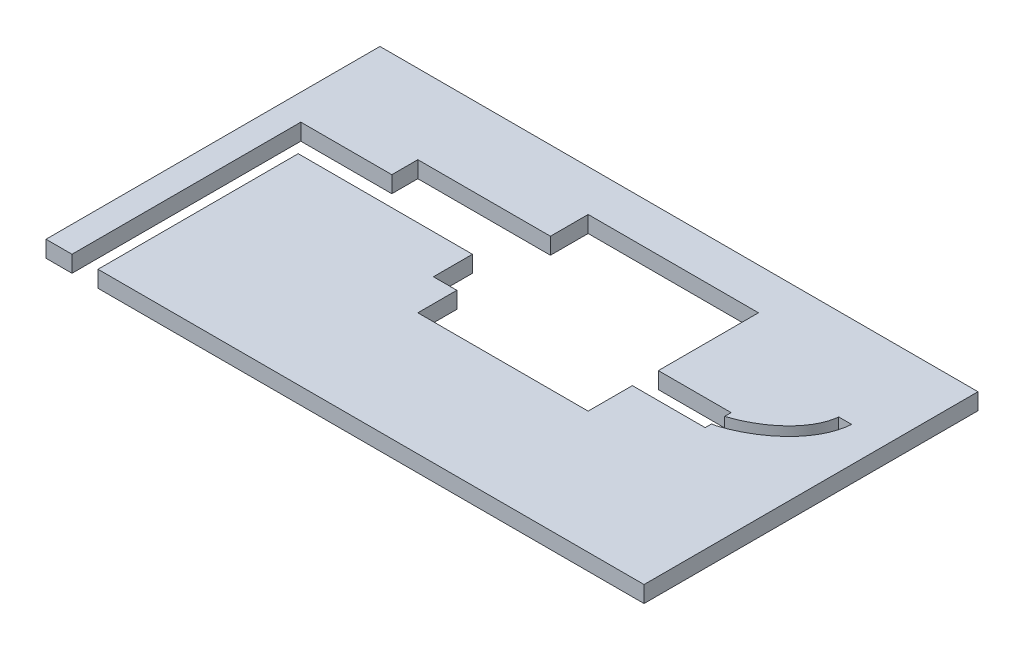
ISO-10303-21;
HEADER;
FILE_DESCRIPTION(('STEP AP214'),'2;1');
FILE_NAME('part.step','',(''),(''),'','','');
FILE_SCHEMA(('AUTOMOTIVE_DESIGN { 1 0 10303 214 1 1 1 1 }'));
ENDSEC;
DATA;
#1=APPLICATION_CONTEXT('core data for automotive mechanical design processes');
#2=APPLICATION_PROTOCOL_DEFINITION('international standard','automotive_design',2000,#1);
#3=PRODUCT_CONTEXT('',#1,'mechanical');
#4=PRODUCT('Part','Part','',(#3));
#5=PRODUCT_RELATED_PRODUCT_CATEGORY('part','',(#4));
#6=PRODUCT_DEFINITION_FORMATION('','',#4);
#7=PRODUCT_DEFINITION_CONTEXT('part definition',#1,'design');
#8=PRODUCT_DEFINITION('design','',#6,#7);
#9=PRODUCT_DEFINITION_SHAPE('','',#8);
#10=(LENGTH_UNIT() NAMED_UNIT(*) SI_UNIT(.MILLI.,.METRE.));
#11=(NAMED_UNIT(*) PLANE_ANGLE_UNIT() SI_UNIT($,.RADIAN.));
#12=(NAMED_UNIT(*) SI_UNIT($,.STERADIAN.) SOLID_ANGLE_UNIT());
#13=UNCERTAINTY_MEASURE_WITH_UNIT(LENGTH_MEASURE(1.E-05),#10,'distance_accuracy_value','');
#14=(GEOMETRIC_REPRESENTATION_CONTEXT(3) GLOBAL_UNCERTAINTY_ASSIGNED_CONTEXT((#13)) GLOBAL_UNIT_ASSIGNED_CONTEXT((#10,
#11,#12)) REPRESENTATION_CONTEXT('',''));
#15=CARTESIAN_POINT('',(0.,0.,0.));
#16=DIRECTION('',(0.,0.,1.));
#17=DIRECTION('',(1.,0.,0.));
#18=AXIS2_PLACEMENT_3D('',#15,#16,#17);
#19=CARTESIAN_POINT('',(115.,6.35,64.2155178586557));
#20=DIRECTION('',(-1.,0.,0.));
#21=DIRECTION('',(0.,0.,1.));
#22=AXIS2_PLACEMENT_3D('',#19,#20,#21);
#23=PLANE('',#22);
#24=DIRECTION('',(0.,0.,-1.));
#25=VECTOR('',#24,1.);
#26=CARTESIAN_POINT('',(115.,0.,64.2155178586557));
#27=LINE('',#26,#25);
#28=CARTESIAN_POINT('',(115.,0.,64.2155178586557));
#29=VERTEX_POINT('',#28);
#30=CARTESIAN_POINT('',(115.,0.,-64.2155178586557));
#31=VERTEX_POINT('',#30);
#32=EDGE_CURVE('E243',#29,#31,#27,.T.);
#33=ORIENTED_EDGE('',*,*,#32,.T.);
#34=DIRECTION('',(0.,-1.,0.));
#35=VECTOR('',#34,1.);
#36=CARTESIAN_POINT('',(115.,6.35,-64.2155178586557));
#37=LINE('',#36,#35);
#38=CARTESIAN_POINT('',(115.,6.35,-64.2155178586557));
#39=VERTEX_POINT('',#38);
#40=EDGE_CURVE('E11',#39,#31,#37,.T.);
#41=ORIENTED_EDGE('',*,*,#40,.F.);
#42=DIRECTION('',(0.,0.,-1.));
#43=VECTOR('',#42,1.);
#44=CARTESIAN_POINT('',(115.,6.35,64.2155178586557));
#45=LINE('',#44,#43);
#46=CARTESIAN_POINT('',(115.,6.35,64.2155178586557));
#47=VERTEX_POINT('',#46);
#48=EDGE_CURVE('E305',#47,#39,#45,.T.);
#49=ORIENTED_EDGE('',*,*,#48,.F.);
#50=DIRECTION('',(0.,-1.,0.));
#51=VECTOR('',#50,1.);
#52=CARTESIAN_POINT('',(115.,6.35,64.2155178586557));
#53=LINE('',#52,#51);
#54=EDGE_CURVE('E239',#47,#29,#53,.T.);
#55=ORIENTED_EDGE('',*,*,#54,.T.);
#56=EDGE_LOOP('',(#33,#41,#49,#55));
#57=FACE_BOUND('',#56,.T.);
#58=ADVANCED_FACE('F33',(#57),#23,.F.);
#59=CARTESIAN_POINT('',(-115.,6.35,-64.2155178586557));
#60=DIRECTION('',(0.,0.,1.));
#61=DIRECTION('',(1.,0.,0.));
#62=AXIS2_PLACEMENT_3D('',#59,#60,#61);
#63=PLANE('',#62);
#64=DIRECTION('',(-1.,0.,0.));
#65=VECTOR('',#64,1.);
#66=CARTESIAN_POINT('',(-115.,0.,-64.2155178586557));
#67=LINE('',#66,#65);
#68=CARTESIAN_POINT('',(-115.,0.,-64.2155178586557));
#69=VERTEX_POINT('',#68);
#70=EDGE_CURVE('E246',#31,#69,#67,.T.);
#71=ORIENTED_EDGE('',*,*,#70,.T.);
#72=DIRECTION('',(0.,-1.,0.));
#73=VECTOR('',#72,1.);
#74=CARTESIAN_POINT('',(-115.,6.35,-64.2155178586557));
#75=LINE('',#74,#73);
#76=CARTESIAN_POINT('',(-115.,6.35,-64.2155178586557));
#77=VERTEX_POINT('',#76);
#78=EDGE_CURVE('E41',#77,#69,#75,.T.);
#79=ORIENTED_EDGE('',*,*,#78,.F.);
#80=DIRECTION('',(-1.,0.,0.));
#81=VECTOR('',#80,1.);
#82=CARTESIAN_POINT('',(-115.,6.35,-64.2155178586557));
#83=LINE('',#82,#81);
#84=EDGE_CURVE('E149',#39,#77,#83,.T.);
#85=ORIENTED_EDGE('',*,*,#84,.F.);
#86=ORIENTED_EDGE('',*,*,#40,.T.);
#87=EDGE_LOOP('',(#71,#79,#85,#86));
#88=FACE_BOUND('',#87,.T.);
#89=ADVANCED_FACE('F470',(#88),#63,.F.);
#90=CARTESIAN_POINT('',(-115.,6.35,64.2155178586557));
#91=DIRECTION('',(1.,0.,0.));
#92=DIRECTION('',(0.,0.,-1.));
#93=AXIS2_PLACEMENT_3D('',#90,#91,#92);
#94=PLANE('',#93);
#95=DIRECTION('',(0.,0.,1.));
#96=VECTOR('',#95,1.);
#97=CARTESIAN_POINT('',(-115.,0.,64.2155178586557));
#98=LINE('',#97,#96);
#99=CARTESIAN_POINT('',(-115.,0.,64.2155178586557));
#100=VERTEX_POINT('',#99);
#101=EDGE_CURVE('E248',#69,#100,#98,.T.);
#102=ORIENTED_EDGE('',*,*,#101,.T.);
#103=DIRECTION('',(0.,-1.,0.));
#104=VECTOR('',#103,1.);
#105=CARTESIAN_POINT('',(-115.,6.35,64.2155178586557));
#106=LINE('',#105,#104);
#107=CARTESIAN_POINT('',(-115.,6.35,64.2155178586557));
#108=VERTEX_POINT('',#107);
#109=EDGE_CURVE('E369',#108,#100,#106,.T.);
#110=ORIENTED_EDGE('',*,*,#109,.F.);
#111=DIRECTION('',(0.,0.,1.));
#112=VECTOR('',#111,1.);
#113=CARTESIAN_POINT('',(-115.,6.35,64.2155178586557));
#114=LINE('',#113,#112);
#115=EDGE_CURVE('E377',#77,#108,#114,.T.);
#116=ORIENTED_EDGE('',*,*,#115,.F.);
#117=ORIENTED_EDGE('',*,*,#78,.T.);
#118=EDGE_LOOP('',(#102,#110,#116,#117));
#119=FACE_BOUND('',#118,.T.);
#120=ADVANCED_FACE('F375',(#119),#94,.F.);
#121=CARTESIAN_POINT('',(-115.,6.35,64.2155178586557));
#122=DIRECTION('',(0.,0.,-1.));
#123=DIRECTION('',(-1.,0.,0.));
#124=AXIS2_PLACEMENT_3D('',#121,#122,#123);
#125=PLANE('',#124);
#126=DIRECTION('',(1.,0.,0.));
#127=VECTOR('',#126,1.);
#128=CARTESIAN_POINT('',(-115.,0.,64.2155178586557));
#129=LINE('',#128,#127);
#130=CARTESIAN_POINT('',(-105.,0.,64.2155178586557));
#131=VERTEX_POINT('',#130);
#132=EDGE_CURVE('E250',#100,#131,#129,.T.);
#133=ORIENTED_EDGE('',*,*,#132,.T.);
#134=DIRECTION('',(0.,-1.,0.));
#135=VECTOR('',#134,1.);
#136=CARTESIAN_POINT('',(-105.,6.35,64.2155178586557));
#137=LINE('',#136,#135);
#138=CARTESIAN_POINT('',(-105.,6.35,64.2155178586557));
#139=VERTEX_POINT('',#138);
#140=EDGE_CURVE('E366',#139,#131,#137,.T.);
#141=ORIENTED_EDGE('',*,*,#140,.F.);
#142=DIRECTION('',(1.,0.,0.));
#143=VECTOR('',#142,1.);
#144=CARTESIAN_POINT('',(-115.,6.35,64.2155178586557));
#145=LINE('',#144,#143);
#146=EDGE_CURVE('E395',#108,#139,#145,.T.);
#147=ORIENTED_EDGE('',*,*,#146,.F.);
#148=ORIENTED_EDGE('',*,*,#109,.T.);
#149=EDGE_LOOP('',(#133,#141,#147,#148));
#150=FACE_BOUND('',#149,.T.);
#151=ADVANCED_FACE('F386',(#150),#125,.F.);
#152=CARTESIAN_POINT('',(-105.,6.35,-23.7844821413443));
#153=DIRECTION('',(-1.,0.,0.));
#154=DIRECTION('',(0.,0.,1.));
#155=AXIS2_PLACEMENT_3D('',#152,#153,#154);
#156=PLANE('',#155);
#157=DIRECTION('',(0.,0.,-1.));
#158=VECTOR('',#157,1.);
#159=CARTESIAN_POINT('',(-105.,0.,-23.7844821413443));
#160=LINE('',#159,#158);
#161=CARTESIAN_POINT('',(-105.,0.,-23.7844821413443));
#162=VERTEX_POINT('',#161);
#163=EDGE_CURVE('E252',#131,#162,#160,.T.);
#164=ORIENTED_EDGE('',*,*,#163,.T.);
#165=DIRECTION('',(0.,-1.,0.));
#166=VECTOR('',#165,1.);
#167=CARTESIAN_POINT('',(-105.,6.35,-23.7844821413443));
#168=LINE('',#167,#166);
#169=CARTESIAN_POINT('',(-105.,6.35,-23.7844821413443));
#170=VERTEX_POINT('',#169);
#171=EDGE_CURVE('E363',#170,#162,#168,.T.);
#172=ORIENTED_EDGE('',*,*,#171,.F.);
#173=DIRECTION('',(0.,0.,-1.));
#174=VECTOR('',#173,1.);
#175=CARTESIAN_POINT('',(-105.,6.35,-23.7844821413443));
#176=LINE('',#175,#174);
#177=EDGE_CURVE('E392',#139,#170,#176,.T.);
#178=ORIENTED_EDGE('',*,*,#177,.F.);
#179=ORIENTED_EDGE('',*,*,#140,.T.);
#180=EDGE_LOOP('',(#164,#172,#178,#179));
#181=FACE_BOUND('',#180,.T.);
#182=ADVANCED_FACE('F390',(#181),#156,.F.);
#183=CARTESIAN_POINT('',(-70.,6.35,-23.7844821413443));
#184=DIRECTION('',(0.,0.,-1.));
#185=DIRECTION('',(-1.,0.,0.));
#186=AXIS2_PLACEMENT_3D('',#183,#184,#185);
#187=PLANE('',#186);
#188=DIRECTION('',(1.,0.,0.));
#189=VECTOR('',#188,1.);
#190=CARTESIAN_POINT('',(-70.,0.,-23.7844821413443));
#191=LINE('',#190,#189);
#192=CARTESIAN_POINT('',(-70.,0.,-23.7844821413443));
#193=VERTEX_POINT('',#192);
#194=EDGE_CURVE('E254',#162,#193,#191,.T.);
#195=ORIENTED_EDGE('',*,*,#194,.T.);
#196=DIRECTION('',(0.,-1.,0.));
#197=VECTOR('',#196,1.);
#198=CARTESIAN_POINT('',(-70.,6.35,-23.7844821413443));
#199=LINE('',#198,#197);
#200=CARTESIAN_POINT('',(-70.,6.35,-23.7844821413443));
#201=VERTEX_POINT('',#200);
#202=EDGE_CURVE('E360',#201,#193,#199,.T.);
#203=ORIENTED_EDGE('',*,*,#202,.F.);
#204=DIRECTION('',(1.,0.,0.));
#205=VECTOR('',#204,1.);
#206=CARTESIAN_POINT('',(-70.,6.35,-23.7844821413443));
#207=LINE('',#206,#205);
#208=EDGE_CURVE('E394',#170,#201,#207,.T.);
#209=ORIENTED_EDGE('',*,*,#208,.F.);
#210=ORIENTED_EDGE('',*,*,#171,.T.);
#211=EDGE_LOOP('',(#195,#203,#209,#210));
#212=FACE_BOUND('',#211,.T.);
#213=ADVANCED_FACE('F460',(#212),#187,.F.);
#214=CARTESIAN_POINT('',(-70.,6.35,-33.7844821413443));
#215=DIRECTION('',(-1.,0.,0.));
#216=DIRECTION('',(0.,0.,1.));
#217=AXIS2_PLACEMENT_3D('',#214,#215,#216);
#218=PLANE('',#217);
#219=DIRECTION('',(0.,0.,-1.));
#220=VECTOR('',#219,1.);
#221=CARTESIAN_POINT('',(-70.,0.,-33.7844821413443));
#222=LINE('',#221,#220);
#223=CARTESIAN_POINT('',(-70.,0.,-33.7844821413443));
#224=VERTEX_POINT('',#223);
#225=EDGE_CURVE('E256',#193,#224,#222,.T.);
#226=ORIENTED_EDGE('',*,*,#225,.T.);
#227=DIRECTION('',(0.,-1.,0.));
#228=VECTOR('',#227,1.);
#229=CARTESIAN_POINT('',(-70.,6.35,-33.7844821413443));
#230=LINE('',#229,#228);
#231=CARTESIAN_POINT('',(-70.,6.35,-33.7844821413443));
#232=VERTEX_POINT('',#231);
#233=EDGE_CURVE('E357',#232,#224,#230,.T.);
#234=ORIENTED_EDGE('',*,*,#233,.F.);
#235=DIRECTION('',(0.,0.,-1.));
#236=VECTOR('',#235,1.);
#237=CARTESIAN_POINT('',(-70.,6.35,-33.7844821413443));
#238=LINE('',#237,#236);
#239=EDGE_CURVE('E397',#201,#232,#238,.T.);
#240=ORIENTED_EDGE('',*,*,#239,.F.);
#241=ORIENTED_EDGE('',*,*,#202,.T.);
#242=EDGE_LOOP('',(#226,#234,#240,#241));
#243=FACE_BOUND('',#242,.T.);
#244=ADVANCED_FACE('F456',(#243),#218,.F.);
#245=CARTESIAN_POINT('',(-19.,6.35,-33.7844821413443));
#246=DIRECTION('',(0.,0.,-1.));
#247=DIRECTION('',(-1.,0.,0.));
#248=AXIS2_PLACEMENT_3D('',#245,#246,#247);
#249=PLANE('',#248);
#250=DIRECTION('',(1.,0.,0.));
#251=VECTOR('',#250,1.);
#252=CARTESIAN_POINT('',(-19.,0.,-33.7844821413443));
#253=LINE('',#252,#251);
#254=CARTESIAN_POINT('',(-19.,0.,-33.7844821413443));
#255=VERTEX_POINT('',#254);
#256=EDGE_CURVE('E258',#224,#255,#253,.T.);
#257=ORIENTED_EDGE('',*,*,#256,.T.);
#258=DIRECTION('',(0.,-1.,0.));
#259=VECTOR('',#258,1.);
#260=CARTESIAN_POINT('',(-19.,6.35,-33.7844821413443));
#261=LINE('',#260,#259);
#262=CARTESIAN_POINT('',(-19.,6.35,-33.7844821413443));
#263=VERTEX_POINT('',#262);
#264=EDGE_CURVE('E354',#263,#255,#261,.T.);
#265=ORIENTED_EDGE('',*,*,#264,.F.);
#266=DIRECTION('',(1.,0.,0.));
#267=VECTOR('',#266,1.);
#268=CARTESIAN_POINT('',(-19.,6.35,-33.7844821413443));
#269=LINE('',#268,#267);
#270=EDGE_CURVE('E403',#232,#263,#269,.T.);
#271=ORIENTED_EDGE('',*,*,#270,.F.);
#272=ORIENTED_EDGE('',*,*,#233,.T.);
#273=EDGE_LOOP('',(#257,#265,#271,#272));
#274=FACE_BOUND('',#273,.T.);
#275=ADVANCED_FACE('F452',(#274),#249,.F.);
#276=CARTESIAN_POINT('',(-19.,6.35,-48.2844821413443));
#277=DIRECTION('',(-1.,0.,0.));
#278=DIRECTION('',(0.,0.,1.));
#279=AXIS2_PLACEMENT_3D('',#276,#277,#278);
#280=PLANE('',#279);
#281=DIRECTION('',(0.,0.,-1.));
#282=VECTOR('',#281,1.);
#283=CARTESIAN_POINT('',(-19.,0.,-48.2844821413443));
#284=LINE('',#283,#282);
#285=CARTESIAN_POINT('',(-19.,0.,-48.2844821413443));
#286=VERTEX_POINT('',#285);
#287=EDGE_CURVE('E260',#255,#286,#284,.T.);
#288=ORIENTED_EDGE('',*,*,#287,.T.);
#289=DIRECTION('',(0.,-1.,0.));
#290=VECTOR('',#289,1.);
#291=CARTESIAN_POINT('',(-19.,6.35,-48.2844821413443));
#292=LINE('',#291,#290);
#293=CARTESIAN_POINT('',(-19.,6.35,-48.2844821413443));
#294=VERTEX_POINT('',#293);
#295=EDGE_CURVE('E351',#294,#286,#292,.T.);
#296=ORIENTED_EDGE('',*,*,#295,.F.);
#297=DIRECTION('',(0.,0.,-1.));
#298=VECTOR('',#297,1.);
#299=CARTESIAN_POINT('',(-19.,6.35,-48.2844821413443));
#300=LINE('',#299,#298);
#301=EDGE_CURVE('E405',#263,#294,#300,.T.);
#302=ORIENTED_EDGE('',*,*,#301,.F.);
#303=ORIENTED_EDGE('',*,*,#264,.T.);
#304=EDGE_LOOP('',(#288,#296,#302,#303));
#305=FACE_BOUND('',#304,.T.);
#306=ADVANCED_FACE('F448',(#305),#280,.F.);
#307=CARTESIAN_POINT('',(46.5,6.35,-48.2844821413443));
#308=DIRECTION('',(0.,0.,-1.));
#309=DIRECTION('',(-1.,0.,0.));
#310=AXIS2_PLACEMENT_3D('',#307,#308,#309);
#311=PLANE('',#310);
#312=DIRECTION('',(1.,0.,0.));
#313=VECTOR('',#312,1.);
#314=CARTESIAN_POINT('',(46.5,0.,-48.2844821413443));
#315=LINE('',#314,#313);
#316=CARTESIAN_POINT('',(46.5,0.,-48.2844821413443));
#317=VERTEX_POINT('',#316);
#318=EDGE_CURVE('E262',#286,#317,#315,.T.);
#319=ORIENTED_EDGE('',*,*,#318,.T.);
#320=DIRECTION('',(0.,-1.,0.));
#321=VECTOR('',#320,1.);
#322=CARTESIAN_POINT('',(46.5,6.35,-48.2844821413443));
#323=LINE('',#322,#321);
#324=CARTESIAN_POINT('',(46.5,6.35,-48.2844821413443));
#325=VERTEX_POINT('',#324);
#326=EDGE_CURVE('E348',#325,#317,#323,.T.);
#327=ORIENTED_EDGE('',*,*,#326,.F.);
#328=DIRECTION('',(1.,0.,0.));
#329=VECTOR('',#328,1.);
#330=CARTESIAN_POINT('',(46.5,6.35,-48.2844821413443));
#331=LINE('',#330,#329);
#332=EDGE_CURVE('E407',#294,#325,#331,.T.);
#333=ORIENTED_EDGE('',*,*,#332,.F.);
#334=ORIENTED_EDGE('',*,*,#295,.T.);
#335=EDGE_LOOP('',(#319,#327,#333,#334));
#336=FACE_BOUND('',#335,.T.);
#337=ADVANCED_FACE('F444',(#336),#311,.F.);
#338=CARTESIAN_POINT('',(46.5,6.35,-9.78448214134429));
#339=DIRECTION('',(1.,0.,0.));
#340=DIRECTION('',(0.,0.,-1.));
#341=AXIS2_PLACEMENT_3D('',#338,#339,#340);
#342=PLANE('',#341);
#343=DIRECTION('',(0.,0.,1.));
#344=VECTOR('',#343,1.);
#345=CARTESIAN_POINT('',(46.5,0.,-9.78448214134429));
#346=LINE('',#345,#344);
#347=CARTESIAN_POINT('',(46.5,0.,-9.78448214134429));
#348=VERTEX_POINT('',#347);
#349=EDGE_CURVE('E264',#317,#348,#346,.T.);
#350=ORIENTED_EDGE('',*,*,#349,.T.);
#351=DIRECTION('',(0.,-1.,0.));
#352=VECTOR('',#351,1.);
#353=CARTESIAN_POINT('',(46.5,6.35,-9.78448214134429));
#354=LINE('',#353,#352);
#355=CARTESIAN_POINT('',(46.5,6.35,-9.78448214134429));
#356=VERTEX_POINT('',#355);
#357=EDGE_CURVE('E345',#356,#348,#354,.T.);
#358=ORIENTED_EDGE('',*,*,#357,.F.);
#359=DIRECTION('',(0.,0.,1.));
#360=VECTOR('',#359,1.);
#361=CARTESIAN_POINT('',(46.5,6.35,-9.78448214134429));
#362=LINE('',#361,#360);
#363=EDGE_CURVE('E409',#325,#356,#362,.T.);
#364=ORIENTED_EDGE('',*,*,#363,.F.);
#365=ORIENTED_EDGE('',*,*,#326,.T.);
#366=EDGE_LOOP('',(#350,#358,#364,#365));
#367=FACE_BOUND('',#366,.T.);
#368=ADVANCED_FACE('F440',(#367),#342,.F.);
#369=CARTESIAN_POINT('',(74.5,6.35,-9.78448214134429));
#370=DIRECTION('',(0.,0.,-1.));
#371=DIRECTION('',(-1.,0.,0.));
#372=AXIS2_PLACEMENT_3D('',#369,#370,#371);
#373=PLANE('',#372);
#374=DIRECTION('',(1.,0.,0.));
#375=VECTOR('',#374,1.);
#376=CARTESIAN_POINT('',(74.5,0.,-9.78448214134429));
#377=LINE('',#376,#375);
#378=CARTESIAN_POINT('',(74.5,0.,-9.78448214134429));
#379=VERTEX_POINT('',#378);
#380=EDGE_CURVE('E266',#348,#379,#377,.T.);
#381=ORIENTED_EDGE('',*,*,#380,.T.);
#382=DIRECTION('',(0.,-1.,0.));
#383=VECTOR('',#382,1.);
#384=CARTESIAN_POINT('',(74.5,6.35,-9.78448214134429));
#385=LINE('',#384,#383);
#386=CARTESIAN_POINT('',(74.5,6.35,-9.78448214134429));
#387=VERTEX_POINT('',#386);
#388=EDGE_CURVE('E342',#387,#379,#385,.T.);
#389=ORIENTED_EDGE('',*,*,#388,.F.);
#390=DIRECTION('',(1.,0.,0.));
#391=VECTOR('',#390,1.);
#392=CARTESIAN_POINT('',(74.5,6.35,-9.78448214134429));
#393=LINE('',#392,#391);
#394=EDGE_CURVE('E411',#356,#387,#393,.T.);
#395=ORIENTED_EDGE('',*,*,#394,.F.);
#396=ORIENTED_EDGE('',*,*,#357,.T.);
#397=EDGE_LOOP('',(#381,#389,#395,#396));
#398=FACE_BOUND('',#397,.T.);
#399=ADVANCED_FACE('F436',(#398),#373,.F.);
#400=CARTESIAN_POINT('',(74.5,6.35,-7.28448214134429));
#401=DIRECTION('',(1.,0.,0.));
#402=DIRECTION('',(0.,0.,-1.));
#403=AXIS2_PLACEMENT_3D('',#400,#401,#402);
#404=PLANE('',#403);
#405=DIRECTION('',(0.,0.,1.));
#406=VECTOR('',#405,1.);
#407=CARTESIAN_POINT('',(74.5,0.,-7.28448214134429));
#408=LINE('',#407,#406);
#409=CARTESIAN_POINT('',(74.5,0.,-7.28448214134429));
#410=VERTEX_POINT('',#409);
#411=EDGE_CURVE('E268',#379,#410,#408,.T.);
#412=ORIENTED_EDGE('',*,*,#411,.T.);
#413=DIRECTION('',(0.,-1.,0.));
#414=VECTOR('',#413,1.);
#415=CARTESIAN_POINT('',(74.5,6.35,-7.28448214134429));
#416=LINE('',#415,#414);
#417=CARTESIAN_POINT('',(74.5,6.35,-7.28448214134429));
#418=VERTEX_POINT('',#417);
#419=EDGE_CURVE('E339',#418,#410,#416,.T.);
#420=ORIENTED_EDGE('',*,*,#419,.F.);
#421=DIRECTION('',(0.,0.,1.));
#422=VECTOR('',#421,1.);
#423=CARTESIAN_POINT('',(74.5,6.35,-7.28448214134429));
#424=LINE('',#423,#422);
#425=EDGE_CURVE('E413',#387,#418,#424,.T.);
#426=ORIENTED_EDGE('',*,*,#425,.F.);
#427=ORIENTED_EDGE('',*,*,#388,.T.);
#428=EDGE_LOOP('',(#412,#420,#426,#427));
#429=FACE_BOUND('',#428,.T.);
#430=ADVANCED_FACE('F431',(#429),#404,.F.);
#431=CARTESIAN_POINT('',(74.5,6.35,-7.28448214134429));
#432=CARTESIAN_POINT('',(78.9418125591606,6.35,-8.67996307831745));
#433=CARTESIAN_POINT('',(89.5981053327591,6.35,-14.1603615226687));
#434=CARTESIAN_POINT('',(96.0618672189593,6.35,-23.1894719508406));
#435=CARTESIAN_POINT('',(96.6106136436586,6.35,-29.0344821413443));
#436=B_SPLINE_CURVE_WITH_KNOTS('',3,(#431,#432,#433,#434,#435),.UNSPECIFIED.,.F.,.F.,(4,1,4),
(0.,0.139776100937577,0.343963843553534),.UNSPECIFIED.);
#437=DIRECTION('',(0.,-1.,0.));
#438=VECTOR('',#437,1.);
#439=SURFACE_OF_LINEAR_EXTRUSION('',#436,#438);
#440=CARTESIAN_POINT('',(74.5,0.,-7.28448214134429));
#441=CARTESIAN_POINT('',(78.9418125591606,0.,-8.67996307831745));
#442=CARTESIAN_POINT('',(89.5981053327591,0.,-14.1603615226687));
#443=CARTESIAN_POINT('',(96.0618672189593,0.,-23.1894719508406));
#444=CARTESIAN_POINT('',(96.6106136436586,0.,-29.0344821413443));
#445=B_SPLINE_CURVE_WITH_KNOTS('',3,(#440,#441,#442,#443,#444),.UNSPECIFIED.,.F.,.F.,(4,1,4),
(0.,0.139776100937577,0.343963843553534),.UNSPECIFIED.);
#446=CARTESIAN_POINT('',(96.6106136436586,0.,-29.0344821413443));
#447=VERTEX_POINT('',#446);
#448=EDGE_CURVE('E270',#410,#447,#445,.T.);
#449=ORIENTED_EDGE('',*,*,#448,.T.);
#450=DIRECTION('',(0.,-1.,0.));
#451=VECTOR('',#450,1.);
#452=CARTESIAN_POINT('',(96.6106136436586,6.35,-29.0344821413443));
#453=LINE('',#452,#451);
#454=CARTESIAN_POINT('',(96.6106136436586,6.35,-29.0344821413443));
#455=VERTEX_POINT('',#454);
#456=EDGE_CURVE('E336',#455,#447,#453,.T.);
#457=ORIENTED_EDGE('',*,*,#456,.F.);
#458=EDGE_CURVE('E415',#418,#455,#436,.T.);
#459=ORIENTED_EDGE('',*,*,#458,.F.);
#460=ORIENTED_EDGE('',*,*,#419,.T.);
#461=EDGE_LOOP('',(#449,#457,#459,#460));
#462=FACE_BOUND('',#461,.T.);
#463=ADVANCED_FACE('F426',(#462),#439,.F.);
#464=CARTESIAN_POINT('',(96.6106136436586,6.35,-29.0344821413443));
#465=DIRECTION('',(0.,0.,-1.));
#466=DIRECTION('',(-1.,0.,0.));
#467=AXIS2_PLACEMENT_3D('',#464,#465,#466);
#468=PLANE('',#467);
#469=DIRECTION('',(1.,0.,0.));
#470=VECTOR('',#469,1.);
#471=CARTESIAN_POINT('',(96.6106136436586,0.,-29.0344821413443));
#472=LINE('',#471,#470);
#473=CARTESIAN_POINT('',(101.594478802042,0.,-29.0344821413443));
#474=VERTEX_POINT('',#473);
#475=EDGE_CURVE('E274',#447,#474,#472,.T.);
#476=ORIENTED_EDGE('',*,*,#475,.T.);
#477=DIRECTION('',(0.,-1.,0.));
#478=VECTOR('',#477,1.);
#479=CARTESIAN_POINT('',(101.594478802042,6.35,-29.0344821413443));
#480=LINE('',#479,#478);
#481=CARTESIAN_POINT('',(101.594478802042,6.35,-29.0344821413443));
#482=VERTEX_POINT('',#481);
#483=EDGE_CURVE('E333',#482,#474,#480,.T.);
#484=ORIENTED_EDGE('',*,*,#483,.F.);
#485=DIRECTION('',(1.,0.,0.));
#486=VECTOR('',#485,1.);
#487=CARTESIAN_POINT('',(96.6106136436586,6.35,-29.0344821413443));
#488=LINE('',#487,#486);
#489=EDGE_CURVE('E420',#455,#482,#488,.T.);
#490=ORIENTED_EDGE('',*,*,#489,.F.);
#491=ORIENTED_EDGE('',*,*,#456,.T.);
#492=EDGE_LOOP('',(#476,#484,#490,#491));
#493=FACE_BOUND('',#492,.T.);
#494=ADVANCED_FACE('F430',(#493),#468,.F.);
#495=CARTESIAN_POINT('',(101.594478802042,6.35,-29.0344821413443));
#496=CARTESIAN_POINT('',(101.497230207617,6.35,-27.6800928478115));
#497=CARTESIAN_POINT('',(100.864778933183,6.35,-24.0204159830603));
#498=CARTESIAN_POINT('',(98.4144549415685,6.35,-18.5795661595881));
#499=CARTESIAN_POINT('',(94.0890567817893,6.35,-13.1462740117478));
#500=CARTESIAN_POINT('',(86.9170034394239,6.35,-7.09206717258545));
#501=CARTESIAN_POINT('',(80.4400750665889,6.35,-3.90701419742919));
#502=CARTESIAN_POINT('',(75.956941240694,6.35,-2.50145776118845));
#503=B_SPLINE_CURVE_WITH_KNOTS('',3,(#495,#496,#497,#498,#499,#500,#501,#502),.UNSPECIFIED.,.F.,
.F.,(4,1,1,1,1,4),(0.,0.0356304474504391,0.0981304474504391,0.160630447450439,0.223130447450439,
0.348130447450439),.UNSPECIFIED.);
#504=DIRECTION('',(0.,-1.,0.));
#505=VECTOR('',#504,1.);
#506=SURFACE_OF_LINEAR_EXTRUSION('',#503,#505);
#507=CARTESIAN_POINT('',(101.594478802042,0.,-29.0344821413443));
#508=CARTESIAN_POINT('',(101.497230207617,0.,-27.6800928478115));
#509=CARTESIAN_POINT('',(100.864778933183,0.,-24.0204159830603));
#510=CARTESIAN_POINT('',(98.4144549415685,0.,-18.5795661595881));
#511=CARTESIAN_POINT('',(94.0890567817893,0.,-13.1462740117478));
#512=CARTESIAN_POINT('',(86.9170034394239,0.,-7.09206717258545));
#513=CARTESIAN_POINT('',(80.4400750665889,0.,-3.90701419742919));
#514=CARTESIAN_POINT('',(75.956941240694,0.,-2.50145776118845));
#515=B_SPLINE_CURVE_WITH_KNOTS('',3,(#507,#508,#509,#510,#511,#512,#513,#514),.UNSPECIFIED.,.F.,
.F.,(4,1,1,1,1,4),(0.,0.0356304474504391,0.0981304474504391,0.160630447450439,0.223130447450439,
0.348130447450439),.UNSPECIFIED.);
#516=CARTESIAN_POINT('',(75.956941240694,0.,-2.50145776118845));
#517=VERTEX_POINT('',#516);
#518=EDGE_CURVE('E279',#474,#517,#515,.T.);
#519=ORIENTED_EDGE('',*,*,#518,.T.);
#520=DIRECTION('',(0.,-1.,0.));
#521=VECTOR('',#520,1.);
#522=CARTESIAN_POINT('',(75.956941240694,6.35,-2.50145776118845));
#523=LINE('',#522,#521);
#524=CARTESIAN_POINT('',(75.956941240694,6.35,-2.50145776118845));
#525=VERTEX_POINT('',#524);
#526=EDGE_CURVE('E330',#525,#517,#523,.T.);
#527=ORIENTED_EDGE('',*,*,#526,.F.);
#528=EDGE_CURVE('E528',#482,#525,#503,.T.);
#529=ORIENTED_EDGE('',*,*,#528,.F.);
#530=ORIENTED_EDGE('',*,*,#483,.T.);
#531=EDGE_LOOP('',(#519,#527,#529,#530));
#532=FACE_BOUND('',#531,.T.);
#533=ADVANCED_FACE('F527',(#532),#506,.F.);
#534=CARTESIAN_POINT('',(74.5,6.35,-2.28448214134429));
#535=DIRECTION('',(0.147300923230021,0.,0.989091723762555));
#536=DIRECTION('',(0.989091723762556,0.,-0.147300923230021));
#537=AXIS2_PLACEMENT_3D('',#534,#535,#536);
#538=PLANE('',#537);
#539=DIRECTION('',(-0.989091723762555,0.,0.147300923230021));
#540=VECTOR('',#539,1.);
#541=CARTESIAN_POINT('',(74.5,0.,-2.28448214134429));
#542=LINE('',#541,#540);
#543=CARTESIAN_POINT('',(74.5,0.,-2.28448214134429));
#544=VERTEX_POINT('',#543);
#545=EDGE_CURVE('E283',#517,#544,#542,.T.);
#546=ORIENTED_EDGE('',*,*,#545,.T.);
#547=DIRECTION('',(0.,-1.,0.));
#548=VECTOR('',#547,1.);
#549=CARTESIAN_POINT('',(74.5,6.35,-2.28448214134429));
#550=LINE('',#549,#548);
#551=CARTESIAN_POINT('',(74.5,6.35,-2.28448214134429));
#552=VERTEX_POINT('',#551);
#553=EDGE_CURVE('E327',#552,#544,#550,.T.);
#554=ORIENTED_EDGE('',*,*,#553,.F.);
#555=DIRECTION('',(-0.989091723762555,0.,0.147300923230021));
#556=VECTOR('',#555,1.);
#557=CARTESIAN_POINT('',(74.5,6.35,-2.28448214134429));
#558=LINE('',#557,#556);
#559=EDGE_CURVE('E523',#525,#552,#558,.T.);
#560=ORIENTED_EDGE('',*,*,#559,.F.);
#561=ORIENTED_EDGE('',*,*,#526,.T.);
#562=EDGE_LOOP('',(#546,#554,#560,#561));
#563=FACE_BOUND('',#562,.T.);
#564=ADVANCED_FACE('F522',(#563),#538,.F.);
#565=CARTESIAN_POINT('',(74.5,6.35,0.215517858655713));
#566=DIRECTION('',(1.,0.,0.));
#567=DIRECTION('',(0.,0.,-1.));
#568=AXIS2_PLACEMENT_3D('',#565,#566,#567);
#569=PLANE('',#568);
#570=DIRECTION('',(0.,0.,1.));
#571=VECTOR('',#570,1.);
#572=CARTESIAN_POINT('',(74.5,0.,0.215517858655713));
#573=LINE('',#572,#571);
#574=CARTESIAN_POINT('',(74.5,0.,0.215517858655713));
#575=VERTEX_POINT('',#574);
#576=EDGE_CURVE('E288',#544,#575,#573,.T.);
#577=ORIENTED_EDGE('',*,*,#576,.T.);
#578=DIRECTION('',(0.,-1.,0.));
#579=VECTOR('',#578,1.);
#580=CARTESIAN_POINT('',(74.5,6.35,0.215517858655713));
#581=LINE('',#580,#579);
#582=CARTESIAN_POINT('',(74.5,6.35,0.215517858655713));
#583=VERTEX_POINT('',#582);
#584=EDGE_CURVE('E324',#583,#575,#581,.T.);
#585=ORIENTED_EDGE('',*,*,#584,.F.);
#586=DIRECTION('',(0.,0.,1.));
#587=VECTOR('',#586,1.);
#588=CARTESIAN_POINT('',(74.5,6.35,0.215517858655713));
#589=LINE('',#588,#587);
#590=EDGE_CURVE('E519',#552,#583,#589,.T.);
#591=ORIENTED_EDGE('',*,*,#590,.F.);
#592=ORIENTED_EDGE('',*,*,#553,.T.);
#593=EDGE_LOOP('',(#577,#585,#591,#592));
#594=FACE_BOUND('',#593,.T.);
#595=ADVANCED_FACE('F516',(#594),#569,.F.);
#596=CARTESIAN_POINT('',(46.5,6.35,0.215517858655713));
#597=DIRECTION('',(0.,0.,1.));
#598=DIRECTION('',(1.,0.,0.));
#599=AXIS2_PLACEMENT_3D('',#596,#597,#598);
#600=PLANE('',#599);
#601=DIRECTION('',(-1.,0.,0.));
#602=VECTOR('',#601,1.);
#603=CARTESIAN_POINT('',(46.5,0.,0.215517858655713));
#604=LINE('',#603,#602);
#605=CARTESIAN_POINT('',(46.5,0.,0.215517858655713));
#606=VERTEX_POINT('',#605);
#607=EDGE_CURVE('E290',#575,#606,#604,.T.);
#608=ORIENTED_EDGE('',*,*,#607,.T.);
#609=DIRECTION('',(0.,-1.,0.));
#610=VECTOR('',#609,1.);
#611=CARTESIAN_POINT('',(46.5,6.35,0.215517858655713));
#612=LINE('',#611,#610);
#613=CARTESIAN_POINT('',(46.5,6.35,0.215517858655713));
#614=VERTEX_POINT('',#613);
#615=EDGE_CURVE('E321',#614,#606,#612,.T.);
#616=ORIENTED_EDGE('',*,*,#615,.F.);
#617=DIRECTION('',(-1.,0.,0.));
#618=VECTOR('',#617,1.);
#619=CARTESIAN_POINT('',(46.5,6.35,0.215517858655713));
#620=LINE('',#619,#618);
#621=EDGE_CURVE('E510',#583,#614,#620,.T.);
#622=ORIENTED_EDGE('',*,*,#621,.F.);
#623=ORIENTED_EDGE('',*,*,#584,.T.);
#624=EDGE_LOOP('',(#608,#616,#622,#623));
#625=FACE_BOUND('',#624,.T.);
#626=ADVANCED_FACE('F509',(#625),#600,.F.);
#627=CARTESIAN_POINT('',(46.5,6.35,17.2155178586557));
#628=DIRECTION('',(1.,0.,0.));
#629=DIRECTION('',(0.,0.,-1.));
#630=AXIS2_PLACEMENT_3D('',#627,#628,#629);
#631=PLANE('',#630);
#632=DIRECTION('',(0.,0.,1.));
#633=VECTOR('',#632,1.);
#634=CARTESIAN_POINT('',(46.5,0.,17.2155178586557));
#635=LINE('',#634,#633);
#636=CARTESIAN_POINT('',(46.5,0.,17.2155178586557));
#637=VERTEX_POINT('',#636);
#638=EDGE_CURVE('E292',#606,#637,#635,.T.);
#639=ORIENTED_EDGE('',*,*,#638,.T.);
#640=DIRECTION('',(0.,-1.,0.));
#641=VECTOR('',#640,1.);
#642=CARTESIAN_POINT('',(46.5,6.35,17.2155178586557));
#643=LINE('',#642,#641);
#644=CARTESIAN_POINT('',(46.5,6.35,17.2155178586557));
#645=VERTEX_POINT('',#644);
#646=EDGE_CURVE('E318',#645,#637,#643,.T.);
#647=ORIENTED_EDGE('',*,*,#646,.F.);
#648=DIRECTION('',(0.,0.,1.));
#649=VECTOR('',#648,1.);
#650=CARTESIAN_POINT('',(46.5,6.35,17.2155178586557));
#651=LINE('',#650,#649);
#652=EDGE_CURVE('E505',#614,#645,#651,.T.);
#653=ORIENTED_EDGE('',*,*,#652,.F.);
#654=ORIENTED_EDGE('',*,*,#615,.T.);
#655=EDGE_LOOP('',(#639,#647,#653,#654));
#656=FACE_BOUND('',#655,.T.);
#657=ADVANCED_FACE('F504',(#656),#631,.F.);
#658=CARTESIAN_POINT('',(-19.,6.35,17.2155178586557));
#659=DIRECTION('',(0.,0.,1.));
#660=DIRECTION('',(1.,0.,0.));
#661=AXIS2_PLACEMENT_3D('',#658,#659,#660);
#662=PLANE('',#661);
#663=DIRECTION('',(-1.,0.,0.));
#664=VECTOR('',#663,1.);
#665=CARTESIAN_POINT('',(-19.,0.,17.2155178586557));
#666=LINE('',#665,#664);
#667=CARTESIAN_POINT('',(-19.,0.,17.2155178586557));
#668=VERTEX_POINT('',#667);
#669=EDGE_CURVE('E294',#637,#668,#666,.T.);
#670=ORIENTED_EDGE('',*,*,#669,.T.);
#671=DIRECTION('',(0.,-1.,0.));
#672=VECTOR('',#671,1.);
#673=CARTESIAN_POINT('',(-19.,6.35,17.2155178586557));
#674=LINE('',#673,#672);
#675=CARTESIAN_POINT('',(-19.,6.35,17.2155178586557));
#676=VERTEX_POINT('',#675);
#677=EDGE_CURVE('E315',#676,#668,#674,.T.);
#678=ORIENTED_EDGE('',*,*,#677,.F.);
#679=DIRECTION('',(-1.,0.,0.));
#680=VECTOR('',#679,1.);
#681=CARTESIAN_POINT('',(-19.,6.35,17.2155178586557));
#682=LINE('',#681,#680);
#683=EDGE_CURVE('E501',#645,#676,#682,.T.);
#684=ORIENTED_EDGE('',*,*,#683,.F.);
#685=ORIENTED_EDGE('',*,*,#646,.T.);
#686=EDGE_LOOP('',(#670,#678,#684,#685));
#687=FACE_BOUND('',#686,.T.);
#688=ADVANCED_FACE('F498',(#687),#662,.F.);
#689=CARTESIAN_POINT('',(-19.,6.35,2.21551785865572));
#690=DIRECTION('',(-1.,0.,0.));
#691=DIRECTION('',(0.,0.,1.));
#692=AXIS2_PLACEMENT_3D('',#689,#690,#691);
#693=PLANE('',#692);
#694=DIRECTION('',(0.,0.,-1.));
#695=VECTOR('',#694,1.);
#696=CARTESIAN_POINT('',(-19.,0.,2.21551785865572));
#697=LINE('',#696,#695);
#698=CARTESIAN_POINT('',(-19.,0.,2.21551785865572));
#699=VERTEX_POINT('',#698);
#700=EDGE_CURVE('E296',#668,#699,#697,.T.);
#701=ORIENTED_EDGE('',*,*,#700,.T.);
#702=DIRECTION('',(0.,-1.,0.));
#703=VECTOR('',#702,1.);
#704=CARTESIAN_POINT('',(-19.,6.35,2.21551785865572));
#705=LINE('',#704,#703);
#706=CARTESIAN_POINT('',(-19.,6.35,2.21551785865572));
#707=VERTEX_POINT('',#706);
#708=EDGE_CURVE('E312',#707,#699,#705,.T.);
#709=ORIENTED_EDGE('',*,*,#708,.F.);
#710=DIRECTION('',(0.,0.,-1.));
#711=VECTOR('',#710,1.);
#712=CARTESIAN_POINT('',(-19.,6.35,2.21551785865572));
#713=LINE('',#712,#711);
#714=EDGE_CURVE('E492',#676,#707,#713,.T.);
#715=ORIENTED_EDGE('',*,*,#714,.F.);
#716=ORIENTED_EDGE('',*,*,#677,.T.);
#717=EDGE_LOOP('',(#701,#709,#715,#716));
#718=FACE_BOUND('',#717,.T.);
#719=ADVANCED_FACE('F491',(#718),#693,.F.);
#720=CARTESIAN_POINT('',(-28.,6.35,2.21551785865572));
#721=DIRECTION('',(0.,0.,1.));
#722=DIRECTION('',(1.,0.,0.));
#723=AXIS2_PLACEMENT_3D('',#720,#721,#722);
#724=PLANE('',#723);
#725=DIRECTION('',(-1.,0.,0.));
#726=VECTOR('',#725,1.);
#727=CARTESIAN_POINT('',(-28.,0.,2.21551785865572));
#728=LINE('',#727,#726);
#729=CARTESIAN_POINT('',(-28.,0.,2.21551785865572));
#730=VERTEX_POINT('',#729);
#731=EDGE_CURVE('E298',#699,#730,#728,.T.);
#732=ORIENTED_EDGE('',*,*,#731,.T.);
#733=DIRECTION('',(0.,-1.,0.));
#734=VECTOR('',#733,1.);
#735=CARTESIAN_POINT('',(-28.,6.35,2.21551785865572));
#736=LINE('',#735,#734);
#737=CARTESIAN_POINT('',(-28.,6.35,2.21551785865572));
#738=VERTEX_POINT('',#737);
#739=EDGE_CURVE('E309',#738,#730,#736,.T.);
#740=ORIENTED_EDGE('',*,*,#739,.F.);
#741=DIRECTION('',(-1.,0.,0.));
#742=VECTOR('',#741,1.);
#743=CARTESIAN_POINT('',(-28.,6.35,2.21551785865572));
#744=LINE('',#743,#742);
#745=EDGE_CURVE('E487',#707,#738,#744,.T.);
#746=ORIENTED_EDGE('',*,*,#745,.F.);
#747=ORIENTED_EDGE('',*,*,#708,.T.);
#748=EDGE_LOOP('',(#732,#740,#746,#747));
#749=FACE_BOUND('',#748,.T.);
#750=ADVANCED_FACE('F486',(#749),#724,.F.);
#751=CARTESIAN_POINT('',(-28.,6.35,-12.7844821413443));
#752=DIRECTION('',(-1.,0.,0.));
#753=DIRECTION('',(0.,0.,1.));
#754=AXIS2_PLACEMENT_3D('',#751,#752,#753);
#755=PLANE('',#754);
#756=DIRECTION('',(0.,0.,-1.));
#757=VECTOR('',#756,1.);
#758=CARTESIAN_POINT('',(-28.,0.,-12.7844821413443));
#759=LINE('',#758,#757);
#760=CARTESIAN_POINT('',(-28.,0.,-12.7844821413443));
#761=VERTEX_POINT('',#760);
#762=EDGE_CURVE('E300',#730,#761,#759,.T.);
#763=ORIENTED_EDGE('',*,*,#762,.T.);
#764=DIRECTION('',(0.,-1.,0.));
#765=VECTOR('',#764,1.);
#766=CARTESIAN_POINT('',(-28.,6.35,-12.7844821413443));
#767=LINE('',#766,#765);
#768=CARTESIAN_POINT('',(-28.,6.35,-12.7844821413443));
#769=VERTEX_POINT('',#768);
#770=EDGE_CURVE('E234',#769,#761,#767,.T.);
#771=ORIENTED_EDGE('',*,*,#770,.F.);
#772=DIRECTION('',(0.,0.,-1.));
#773=VECTOR('',#772,1.);
#774=CARTESIAN_POINT('',(-28.,6.35,-12.7844821413443));
#775=LINE('',#774,#773);
#776=EDGE_CURVE('E225',#738,#769,#775,.T.);
#777=ORIENTED_EDGE('',*,*,#776,.F.);
#778=ORIENTED_EDGE('',*,*,#739,.T.);
#779=EDGE_LOOP('',(#763,#771,#777,#778));
#780=FACE_BOUND('',#779,.T.);
#781=ADVANCED_FACE('F482',(#780),#755,.F.);
#782=CARTESIAN_POINT('',(-95.,6.35,-12.7844821413443));
#783=DIRECTION('',(0.,0.,1.));
#784=DIRECTION('',(1.,0.,0.));
#785=AXIS2_PLACEMENT_3D('',#782,#783,#784);
#786=PLANE('',#785);
#787=DIRECTION('',(-1.,0.,0.));
#788=VECTOR('',#787,1.);
#789=CARTESIAN_POINT('',(-95.,0.,-12.7844821413443));
#790=LINE('',#789,#788);
#791=CARTESIAN_POINT('',(-95.,0.,-12.7844821413443));
#792=VERTEX_POINT('',#791);
#793=EDGE_CURVE('E233',#761,#792,#790,.T.);
#794=ORIENTED_EDGE('',*,*,#793,.T.);
#795=DIRECTION('',(0.,-1.,0.));
#796=VECTOR('',#795,1.);
#797=CARTESIAN_POINT('',(-95.,6.35,-12.7844821413443));
#798=LINE('',#797,#796);
#799=CARTESIAN_POINT('',(-95.,6.35,-12.7844821413443));
#800=VERTEX_POINT('',#799);
#801=EDGE_CURVE('E230',#800,#792,#798,.T.);
#802=ORIENTED_EDGE('',*,*,#801,.F.);
#803=DIRECTION('',(-1.,0.,0.));
#804=VECTOR('',#803,1.);
#805=CARTESIAN_POINT('',(-95.,6.35,-12.7844821413443));
#806=LINE('',#805,#804);
#807=EDGE_CURVE('E219',#769,#800,#806,.T.);
#808=ORIENTED_EDGE('',*,*,#807,.F.);
#809=ORIENTED_EDGE('',*,*,#770,.T.);
#810=EDGE_LOOP('',(#794,#802,#808,#809));
#811=FACE_BOUND('',#810,.T.);
#812=ADVANCED_FACE('F231',(#811),#786,.F.);
#813=CARTESIAN_POINT('',(-95.,6.35,64.2155178586557));
#814=DIRECTION('',(1.,0.,0.));
#815=DIRECTION('',(0.,0.,-1.));
#816=AXIS2_PLACEMENT_3D('',#813,#814,#815);
#817=PLANE('',#816);
#818=DIRECTION('',(0.,0.,1.));
#819=VECTOR('',#818,1.);
#820=CARTESIAN_POINT('',(-95.,0.,64.2155178586557));
#821=LINE('',#820,#819);
#822=CARTESIAN_POINT('',(-95.,0.,64.2155178586557));
#823=VERTEX_POINT('',#822);
#824=EDGE_CURVE('E135',#792,#823,#821,.T.);
#825=ORIENTED_EDGE('',*,*,#824,.T.);
#826=DIRECTION('',(0.,-1.,0.));
#827=VECTOR('',#826,1.);
#828=CARTESIAN_POINT('',(-95.,6.35,64.2155178586557));
#829=LINE('',#828,#827);
#830=CARTESIAN_POINT('',(-95.,6.35,64.2155178586557));
#831=VERTEX_POINT('',#830);
#832=EDGE_CURVE('E235',#831,#823,#829,.T.);
#833=ORIENTED_EDGE('',*,*,#832,.F.);
#834=DIRECTION('',(0.,0.,1.));
#835=VECTOR('',#834,1.);
#836=CARTESIAN_POINT('',(-95.,6.35,64.2155178586557));
#837=LINE('',#836,#835);
#838=EDGE_CURVE('E223',#800,#831,#837,.T.);
#839=ORIENTED_EDGE('',*,*,#838,.F.);
#840=ORIENTED_EDGE('',*,*,#801,.T.);
#841=EDGE_LOOP('',(#825,#833,#839,#840));
#842=FACE_BOUND('',#841,.T.);
#843=ADVANCED_FACE('F237',(#842),#817,.F.);
#844=CARTESIAN_POINT('',(-95.,6.35,64.2155178586557));
#845=DIRECTION('',(0.,0.,-1.));
#846=DIRECTION('',(-1.,0.,0.));
#847=AXIS2_PLACEMENT_3D('',#844,#845,#846);
#848=PLANE('',#847);
#849=DIRECTION('',(1.,0.,0.));
#850=VECTOR('',#849,1.);
#851=CARTESIAN_POINT('',(-95.,0.,64.2155178586557));
#852=LINE('',#851,#850);
#853=EDGE_CURVE('E141',#823,#29,#852,.T.);
#854=ORIENTED_EDGE('',*,*,#853,.T.);
#855=ORIENTED_EDGE('',*,*,#54,.F.);
#856=DIRECTION('',(1.,0.,0.));
#857=VECTOR('',#856,1.);
#858=CARTESIAN_POINT('',(-95.,6.35,64.2155178586557));
#859=LINE('',#858,#857);
#860=EDGE_CURVE('E49',#831,#47,#859,.T.);
#861=ORIENTED_EDGE('',*,*,#860,.F.);
#862=ORIENTED_EDGE('',*,*,#832,.T.);
#863=EDGE_LOOP('',(#854,#855,#861,#862));
#864=FACE_BOUND('',#863,.T.);
#865=ADVANCED_FACE('F588',(#864),#848,.F.);
#866=CARTESIAN_POINT('',(89.3075990665402,6.35,-15.7549196550592));
#867=DIRECTION('',(0.,-1.,0.));
#868=DIRECTION('',(0.,0.,-1.));
#869=AXIS2_PLACEMENT_3D('',#866,#867,#868);
#870=PLANE('',#869);
#871=ORIENTED_EDGE('',*,*,#48,.T.);
#872=ORIENTED_EDGE('',*,*,#84,.T.);
#873=ORIENTED_EDGE('',*,*,#115,.T.);
#874=ORIENTED_EDGE('',*,*,#146,.T.);
#875=ORIENTED_EDGE('',*,*,#177,.T.);
#876=ORIENTED_EDGE('',*,*,#208,.T.);
#877=ORIENTED_EDGE('',*,*,#239,.T.);
#878=ORIENTED_EDGE('',*,*,#270,.T.);
#879=ORIENTED_EDGE('',*,*,#301,.T.);
#880=ORIENTED_EDGE('',*,*,#332,.T.);
#881=ORIENTED_EDGE('',*,*,#363,.T.);
#882=ORIENTED_EDGE('',*,*,#394,.T.);
#883=ORIENTED_EDGE('',*,*,#425,.T.);
#884=ORIENTED_EDGE('',*,*,#458,.T.);
#885=ORIENTED_EDGE('',*,*,#489,.T.);
#886=ORIENTED_EDGE('',*,*,#528,.T.);
#887=ORIENTED_EDGE('',*,*,#559,.T.);
#888=ORIENTED_EDGE('',*,*,#590,.T.);
#889=ORIENTED_EDGE('',*,*,#621,.T.);
#890=ORIENTED_EDGE('',*,*,#652,.T.);
#891=ORIENTED_EDGE('',*,*,#683,.T.);
#892=ORIENTED_EDGE('',*,*,#714,.T.);
#893=ORIENTED_EDGE('',*,*,#745,.T.);
#894=ORIENTED_EDGE('',*,*,#776,.T.);
#895=ORIENTED_EDGE('',*,*,#807,.T.);
#896=ORIENTED_EDGE('',*,*,#838,.T.);
#897=ORIENTED_EDGE('',*,*,#860,.T.);
#898=EDGE_LOOP('',(#871,#872,#873,#874,#875,#876,#877,#878,#879,#880,#881,#882,#883,#884,#885,
#886,#887,#888,#889,#890,#891,#892,#893,#894,#895,#896,#897));
#899=FACE_BOUND('',#898,.T.);
#900=ADVANCED_FACE('F221',(#899),#870,.F.);
#901=CARTESIAN_POINT('',(89.3075990665402,0.,-15.7549196550592));
#902=DIRECTION('',(0.,-1.,0.));
#903=DIRECTION('',(0.,0.,-1.));
#904=AXIS2_PLACEMENT_3D('',#901,#902,#903);
#905=PLANE('',#904);
#906=ORIENTED_EDGE('',*,*,#32,.F.);
#907=ORIENTED_EDGE('',*,*,#853,.F.);
#908=ORIENTED_EDGE('',*,*,#824,.F.);
#909=ORIENTED_EDGE('',*,*,#793,.F.);
#910=ORIENTED_EDGE('',*,*,#762,.F.);
#911=ORIENTED_EDGE('',*,*,#731,.F.);
#912=ORIENTED_EDGE('',*,*,#700,.F.);
#913=ORIENTED_EDGE('',*,*,#669,.F.);
#914=ORIENTED_EDGE('',*,*,#638,.F.);
#915=ORIENTED_EDGE('',*,*,#607,.F.);
#916=ORIENTED_EDGE('',*,*,#576,.F.);
#917=ORIENTED_EDGE('',*,*,#545,.F.);
#918=ORIENTED_EDGE('',*,*,#518,.F.);
#919=ORIENTED_EDGE('',*,*,#475,.F.);
#920=ORIENTED_EDGE('',*,*,#448,.F.);
#921=ORIENTED_EDGE('',*,*,#411,.F.);
#922=ORIENTED_EDGE('',*,*,#380,.F.);
#923=ORIENTED_EDGE('',*,*,#349,.F.);
#924=ORIENTED_EDGE('',*,*,#318,.F.);
#925=ORIENTED_EDGE('',*,*,#287,.F.);
#926=ORIENTED_EDGE('',*,*,#256,.F.);
#927=ORIENTED_EDGE('',*,*,#225,.F.);
#928=ORIENTED_EDGE('',*,*,#194,.F.);
#929=ORIENTED_EDGE('',*,*,#163,.F.);
#930=ORIENTED_EDGE('',*,*,#132,.F.);
#931=ORIENTED_EDGE('',*,*,#101,.F.);
#932=ORIENTED_EDGE('',*,*,#70,.F.);
#933=EDGE_LOOP('',(#906,#907,#908,#909,#910,#911,#912,#913,#914,#915,#916,#917,#918,#919,#920,
#921,#922,#923,#924,#925,#926,#927,#928,#929,#930,#931,#932));
#934=FACE_BOUND('',#933,.T.);
#935=ADVANCED_FACE('F381',(#934),#905,.T.);
#936=CLOSED_SHELL('',(#58,#89,#120,#151,#182,#213,#244,#275,#306,#337,#368,#399,#430,#463,#494,
#533,#564,#595,#626,#657,#688,#719,#750,#781,#812,#843,#865,#900,#935));
#937=MANIFOLD_SOLID_BREP('B2',#936);
#938=ADVANCED_BREP_SHAPE_REPRESENTATION('',(#18,#937),#14);
#939=SHAPE_DEFINITION_REPRESENTATION(#9,#938);
ENDSEC;
END-ISO-10303-21;
